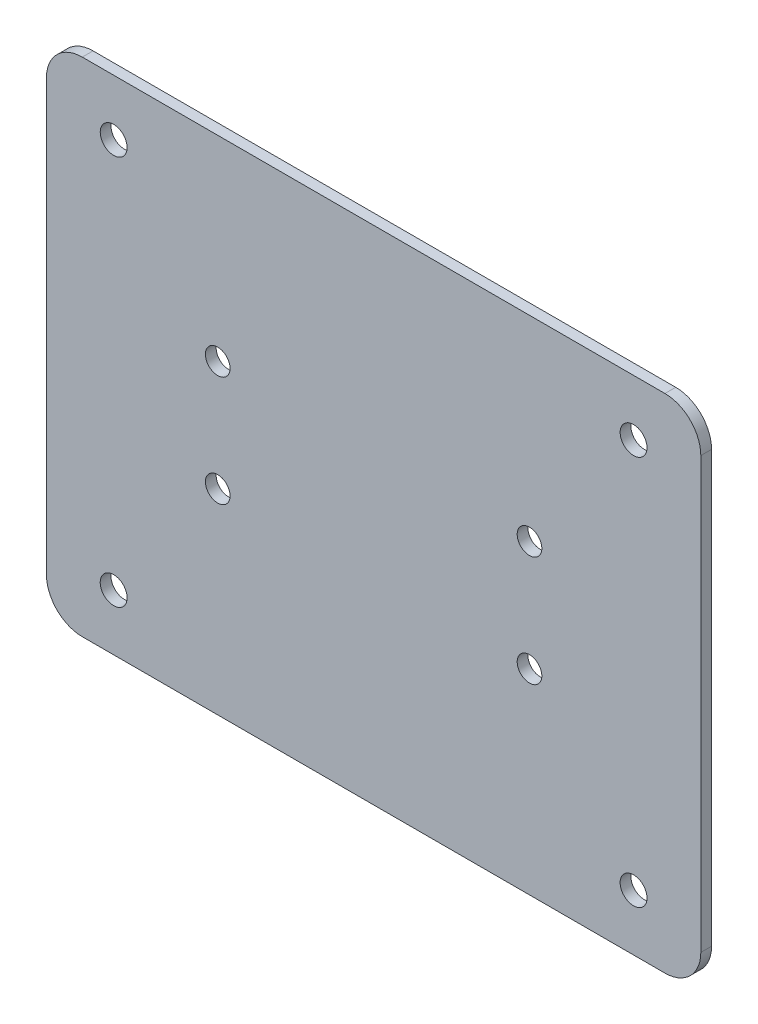
ISO-10303-21;
HEADER;
FILE_DESCRIPTION(('STEP AP214'),'2;1');
FILE_NAME('part.step','',(''),(''),'','','');
FILE_SCHEMA(('AUTOMOTIVE_DESIGN { 1 0 10303 214 1 1 1 1 }'));
ENDSEC;
DATA;
#1=APPLICATION_CONTEXT('core data for automotive mechanical design processes');
#2=APPLICATION_PROTOCOL_DEFINITION('international standard','automotive_design',2000,#1);
#3=PRODUCT_CONTEXT('',#1,'mechanical');
#4=PRODUCT('Part','Part','',(#3));
#5=PRODUCT_RELATED_PRODUCT_CATEGORY('part','',(#4));
#6=PRODUCT_DEFINITION_FORMATION('','',#4);
#7=PRODUCT_DEFINITION_CONTEXT('part definition',#1,'design');
#8=PRODUCT_DEFINITION('design','',#6,#7);
#9=PRODUCT_DEFINITION_SHAPE('','',#8);
#10=(LENGTH_UNIT() NAMED_UNIT(*) SI_UNIT(.MILLI.,.METRE.));
#11=(NAMED_UNIT(*) PLANE_ANGLE_UNIT() SI_UNIT($,.RADIAN.));
#12=(NAMED_UNIT(*) SI_UNIT($,.STERADIAN.) SOLID_ANGLE_UNIT());
#13=UNCERTAINTY_MEASURE_WITH_UNIT(LENGTH_MEASURE(1.E-05),#10,'distance_accuracy_value','');
#14=(GEOMETRIC_REPRESENTATION_CONTEXT(3) GLOBAL_UNCERTAINTY_ASSIGNED_CONTEXT((#13)) GLOBAL_UNIT_ASSIGNED_CONTEXT((#10,
#11,#12)) REPRESENTATION_CONTEXT('',''));
#15=CARTESIAN_POINT('',(0.,0.,0.));
#16=DIRECTION('',(0.,0.,1.));
#17=DIRECTION('',(1.,0.,0.));
#18=AXIS2_PLACEMENT_3D('',#15,#16,#17);
#19=CARTESIAN_POINT('',(0.,0.,1.2));
#20=DIRECTION('',(0.,0.,-1.));
#21=DIRECTION('',(-1.,0.,0.));
#22=AXIS2_PLACEMENT_3D('',#19,#20,#21);
#23=PLANE('',#22);
#24=CARTESIAN_POINT('',(53.89,34.16,1.2));
#25=DIRECTION('',(0.,0.,1.));
#26=DIRECTION('',(-1.,0.,0.));
#27=AXIS2_PLACEMENT_3D('',#24,#25,#26);
#28=CIRCLE('',#27,1.375);
#29=CARTESIAN_POINT('',(52.515,34.16,1.2));
#30=VERTEX_POINT('',#29);
#31=EDGE_CURVE('E204',#30,#30,#28,.T.);
#32=ORIENTED_EDGE('',*,*,#31,.F.);
#33=EDGE_LOOP('',(#32));
#34=FACE_BOUND('',#33,.T.);
#35=CARTESIAN_POINT('',(19.11,21.84,1.2));
#36=DIRECTION('',(0.,0.,1.));
#37=DIRECTION('',(-1.,0.,0.));
#38=AXIS2_PLACEMENT_3D('',#35,#36,#37);
#39=CIRCLE('',#38,1.375);
#40=CARTESIAN_POINT('',(17.735,21.84,1.2));
#41=VERTEX_POINT('',#40);
#42=EDGE_CURVE('E210',#41,#41,#39,.T.);
#43=ORIENTED_EDGE('',*,*,#42,.F.);
#44=EDGE_LOOP('',(#43));
#45=FACE_BOUND('',#44,.T.);
#46=CARTESIAN_POINT('',(19.11,34.16,1.2));
#47=DIRECTION('',(0.,0.,1.));
#48=DIRECTION('',(1.,0.,0.));
#49=AXIS2_PLACEMENT_3D('',#46,#47,#48);
#50=CIRCLE('',#49,1.375);
#51=CARTESIAN_POINT('',(20.485,34.16,1.2));
#52=VERTEX_POINT('',#51);
#53=EDGE_CURVE('E211',#52,#52,#50,.T.);
#54=ORIENTED_EDGE('',*,*,#53,.F.);
#55=EDGE_LOOP('',(#54));
#56=FACE_BOUND('',#55,.T.);
#57=CARTESIAN_POINT('',(53.89,21.84,1.2));
#58=DIRECTION('',(0.,0.,1.));
#59=DIRECTION('',(1.,0.,0.));
#60=AXIS2_PLACEMENT_3D('',#57,#58,#59);
#61=CIRCLE('',#60,1.375);
#62=CARTESIAN_POINT('',(55.265,21.84,1.2));
#63=VERTEX_POINT('',#62);
#64=EDGE_CURVE('E198',#63,#63,#61,.T.);
#65=ORIENTED_EDGE('',*,*,#64,.F.);
#66=EDGE_LOOP('',(#65));
#67=FACE_BOUND('',#66,.T.);
#68=DIRECTION('',(0.,-1.,0.));
#69=VECTOR('',#68,1.);
#70=CARTESIAN_POINT('',(0.,0.,1.2));
#71=LINE('',#70,#69);
#72=CARTESIAN_POINT('',(0.,52.,1.2));
#73=VERTEX_POINT('',#72);
#74=CARTESIAN_POINT('',(0.,4.,1.2));
#75=VERTEX_POINT('',#74);
#76=EDGE_CURVE('E137',#73,#75,#71,.T.);
#77=ORIENTED_EDGE('',*,*,#76,.T.);
#78=CARTESIAN_POINT('',(4.,4.,1.2));
#79=DIRECTION('',(0.,0.,-1.));
#80=DIRECTION('',(-1.,0.,0.));
#81=AXIS2_PLACEMENT_3D('',#78,#79,#80);
#82=CIRCLE('',#81,4.);
#83=CARTESIAN_POINT('',(4.,0.,1.2));
#84=VERTEX_POINT('',#83);
#85=EDGE_CURVE('E152',#75,#84,#82,.F.);
#86=ORIENTED_EDGE('',*,*,#85,.T.);
#87=DIRECTION('',(1.,0.,0.));
#88=VECTOR('',#87,1.);
#89=CARTESIAN_POINT('',(0.,0.,1.2));
#90=LINE('',#89,#88);
#91=CARTESIAN_POINT('',(69.,0.,1.2));
#92=VERTEX_POINT('',#91);
#93=EDGE_CURVE('E119',#84,#92,#90,.T.);
#94=ORIENTED_EDGE('',*,*,#93,.T.);
#95=CARTESIAN_POINT('',(69.,4.,1.2));
#96=DIRECTION('',(0.,0.,-1.));
#97=DIRECTION('',(-1.,0.,0.));
#98=AXIS2_PLACEMENT_3D('',#95,#96,#97);
#99=CIRCLE('',#98,4.);
#100=CARTESIAN_POINT('',(73.,4.,1.2));
#101=VERTEX_POINT('',#100);
#102=EDGE_CURVE('E147',#92,#101,#99,.F.);
#103=ORIENTED_EDGE('',*,*,#102,.T.);
#104=DIRECTION('',(0.,1.,0.));
#105=VECTOR('',#104,1.);
#106=CARTESIAN_POINT('',(73.,0.,1.2));
#107=LINE('',#106,#105);
#108=CARTESIAN_POINT('',(73.,52.,1.2));
#109=VERTEX_POINT('',#108);
#110=EDGE_CURVE('E163',#101,#109,#107,.T.);
#111=ORIENTED_EDGE('',*,*,#110,.T.);
#112=CARTESIAN_POINT('',(69.,52.,1.2));
#113=DIRECTION('',(0.,0.,-1.));
#114=DIRECTION('',(-1.,0.,0.));
#115=AXIS2_PLACEMENT_3D('',#112,#113,#114);
#116=CIRCLE('',#115,4.);
#117=CARTESIAN_POINT('',(69.,56.,1.2));
#118=VERTEX_POINT('',#117);
#119=EDGE_CURVE('E55',#109,#118,#116,.F.);
#120=ORIENTED_EDGE('',*,*,#119,.T.);
#121=DIRECTION('',(-1.,0.,0.));
#122=VECTOR('',#121,1.);
#123=CARTESIAN_POINT('',(0.,56.,1.2));
#124=LINE('',#123,#122);
#125=CARTESIAN_POINT('',(4.,56.,1.2));
#126=VERTEX_POINT('',#125);
#127=EDGE_CURVE('E138',#118,#126,#124,.T.);
#128=ORIENTED_EDGE('',*,*,#127,.T.);
#129=CARTESIAN_POINT('',(4.,52.,1.2));
#130=DIRECTION('',(0.,0.,-1.));
#131=DIRECTION('',(-1.,0.,0.));
#132=AXIS2_PLACEMENT_3D('',#129,#130,#131);
#133=CIRCLE('',#132,4.);
#134=EDGE_CURVE('E150',#126,#73,#133,.F.);
#135=ORIENTED_EDGE('',*,*,#134,.T.);
#136=EDGE_LOOP('',(#77,#86,#94,#103,#111,#120,#128,#135));
#137=FACE_BOUND('',#136,.T.);
#138=CARTESIAN_POINT('',(7.5,6.25,1.2));
#139=DIRECTION('',(0.,0.,1.));
#140=DIRECTION('',(1.,0.,0.));
#141=AXIS2_PLACEMENT_3D('',#138,#139,#140);
#142=CIRCLE('',#141,1.5);
#143=CARTESIAN_POINT('',(9.,6.25,1.2));
#144=VERTEX_POINT('',#143);
#145=EDGE_CURVE('E132',#144,#144,#142,.T.);
#146=ORIENTED_EDGE('',*,*,#145,.F.);
#147=EDGE_LOOP('',(#146));
#148=FACE_BOUND('',#147,.T.);
#149=CARTESIAN_POINT('',(65.5,6.25,1.2));
#150=DIRECTION('',(0.,0.,1.));
#151=DIRECTION('',(-1.,0.,0.));
#152=AXIS2_PLACEMENT_3D('',#149,#150,#151);
#153=CIRCLE('',#152,1.5);
#154=CARTESIAN_POINT('',(64.,6.25,1.2));
#155=VERTEX_POINT('',#154);
#156=EDGE_CURVE('E180',#155,#155,#153,.T.);
#157=ORIENTED_EDGE('',*,*,#156,.F.);
#158=EDGE_LOOP('',(#157));
#159=FACE_BOUND('',#158,.T.);
#160=CARTESIAN_POINT('',(65.5,49.75,1.2));
#161=DIRECTION('',(0.,0.,1.));
#162=DIRECTION('',(1.,0.,0.));
#163=AXIS2_PLACEMENT_3D('',#160,#161,#162);
#164=CIRCLE('',#163,1.5);
#165=CARTESIAN_POINT('',(67.,49.75,1.2));
#166=VERTEX_POINT('',#165);
#167=EDGE_CURVE('E186',#166,#166,#164,.T.);
#168=ORIENTED_EDGE('',*,*,#167,.F.);
#169=EDGE_LOOP('',(#168));
#170=FACE_BOUND('',#169,.T.);
#171=CARTESIAN_POINT('',(7.5,49.75,1.2));
#172=DIRECTION('',(0.,0.,1.));
#173=DIRECTION('',(-1.,0.,0.));
#174=AXIS2_PLACEMENT_3D('',#171,#172,#173);
#175=CIRCLE('',#174,1.5);
#176=CARTESIAN_POINT('',(5.99999999999999,49.75,1.2));
#177=VERTEX_POINT('',#176);
#178=EDGE_CURVE('E192',#177,#177,#175,.T.);
#179=ORIENTED_EDGE('',*,*,#178,.F.);
#180=EDGE_LOOP('',(#179));
#181=FACE_BOUND('',#180,.T.);
#182=ADVANCED_FACE('F33',(#34,#45,#56,#67,#137,#148,#159,#170,#181),#23,.F.);
#183=CARTESIAN_POINT('',(0.,0.,0.));
#184=DIRECTION('',(0.,0.,-1.));
#185=DIRECTION('',(-1.,0.,0.));
#186=AXIS2_PLACEMENT_3D('',#183,#184,#185);
#187=PLANE('',#186);
#188=CARTESIAN_POINT('',(53.89,34.16,0.));
#189=DIRECTION('',(0.,0.,-1.));
#190=DIRECTION('',(-1.,0.,0.));
#191=AXIS2_PLACEMENT_3D('',#188,#189,#190);
#192=CIRCLE('',#191,1.375);
#193=CARTESIAN_POINT('',(52.515,34.16,0.));
#194=VERTEX_POINT('',#193);
#195=EDGE_CURVE('E214',#194,#194,#192,.F.);
#196=ORIENTED_EDGE('',*,*,#195,.T.);
#197=EDGE_LOOP('',(#196));
#198=FACE_BOUND('',#197,.T.);
#199=CARTESIAN_POINT('',(19.11,21.84,0.));
#200=DIRECTION('',(0.,0.,-1.));
#201=DIRECTION('',(-1.,0.,0.));
#202=AXIS2_PLACEMENT_3D('',#199,#200,#201);
#203=CIRCLE('',#202,1.375);
#204=CARTESIAN_POINT('',(17.735,21.84,0.));
#205=VERTEX_POINT('',#204);
#206=EDGE_CURVE('E207',#205,#205,#203,.F.);
#207=ORIENTED_EDGE('',*,*,#206,.T.);
#208=EDGE_LOOP('',(#207));
#209=FACE_BOUND('',#208,.T.);
#210=CARTESIAN_POINT('',(19.11,34.16,0.));
#211=DIRECTION('',(0.,0.,-1.));
#212=DIRECTION('',(-1.,0.,0.));
#213=AXIS2_PLACEMENT_3D('',#210,#211,#212);
#214=CIRCLE('',#213,1.375);
#215=CARTESIAN_POINT('',(17.735,34.16,0.));
#216=VERTEX_POINT('',#215);
#217=EDGE_CURVE('E219',#216,#216,#214,.F.);
#218=ORIENTED_EDGE('',*,*,#217,.T.);
#219=EDGE_LOOP('',(#218));
#220=FACE_BOUND('',#219,.T.);
#221=CARTESIAN_POINT('',(53.89,21.84,0.));
#222=DIRECTION('',(0.,0.,-1.));
#223=DIRECTION('',(-1.,0.,0.));
#224=AXIS2_PLACEMENT_3D('',#221,#222,#223);
#225=CIRCLE('',#224,1.375);
#226=CARTESIAN_POINT('',(52.515,21.84,0.));
#227=VERTEX_POINT('',#226);
#228=EDGE_CURVE('E201',#227,#227,#225,.F.);
#229=ORIENTED_EDGE('',*,*,#228,.T.);
#230=EDGE_LOOP('',(#229));
#231=FACE_BOUND('',#230,.T.);
#232=CARTESIAN_POINT('',(65.5,49.75,0.));
#233=DIRECTION('',(0.,0.,1.));
#234=DIRECTION('',(1.,0.,0.));
#235=AXIS2_PLACEMENT_3D('',#232,#233,#234);
#236=CIRCLE('',#235,1.5);
#237=CARTESIAN_POINT('',(67.,49.75,0.));
#238=VERTEX_POINT('',#237);
#239=EDGE_CURVE('E189',#238,#238,#236,.T.);
#240=ORIENTED_EDGE('',*,*,#239,.T.);
#241=EDGE_LOOP('',(#240));
#242=FACE_BOUND('',#241,.T.);
#243=CARTESIAN_POINT('',(7.5,6.25,0.));
#244=DIRECTION('',(0.,0.,1.));
#245=DIRECTION('',(1.,0.,0.));
#246=AXIS2_PLACEMENT_3D('',#243,#244,#245);
#247=CIRCLE('',#246,1.5);
#248=CARTESIAN_POINT('',(9.,6.25,0.));
#249=VERTEX_POINT('',#248);
#250=EDGE_CURVE('E177',#249,#249,#247,.T.);
#251=ORIENTED_EDGE('',*,*,#250,.T.);
#252=EDGE_LOOP('',(#251));
#253=FACE_BOUND('',#252,.T.);
#254=DIRECTION('',(1.,0.,0.));
#255=VECTOR('',#254,1.);
#256=CARTESIAN_POINT('',(0.,0.,0.));
#257=LINE('',#256,#255);
#258=CARTESIAN_POINT('',(4.,0.,0.));
#259=VERTEX_POINT('',#258);
#260=CARTESIAN_POINT('',(69.,0.,0.));
#261=VERTEX_POINT('',#260);
#262=EDGE_CURVE('E116',#259,#261,#257,.T.);
#263=ORIENTED_EDGE('',*,*,#262,.F.);
#264=CARTESIAN_POINT('',(4.,4.,0.));
#265=DIRECTION('',(0.,0.,-1.));
#266=DIRECTION('',(-1.,0.,0.));
#267=AXIS2_PLACEMENT_3D('',#264,#265,#266);
#268=CIRCLE('',#267,4.);
#269=CARTESIAN_POINT('',(0.,4.,0.));
#270=VERTEX_POINT('',#269);
#271=EDGE_CURVE('E99',#259,#270,#268,.T.);
#272=ORIENTED_EDGE('',*,*,#271,.T.);
#273=DIRECTION('',(0.,-1.,0.));
#274=VECTOR('',#273,1.);
#275=CARTESIAN_POINT('',(0.,0.,0.));
#276=LINE('',#275,#274);
#277=CARTESIAN_POINT('',(0.,52.,0.));
#278=VERTEX_POINT('',#277);
#279=EDGE_CURVE('E127',#278,#270,#276,.T.);
#280=ORIENTED_EDGE('',*,*,#279,.F.);
#281=CARTESIAN_POINT('',(4.,52.,0.));
#282=DIRECTION('',(0.,0.,-1.));
#283=DIRECTION('',(-1.,0.,0.));
#284=AXIS2_PLACEMENT_3D('',#281,#282,#283);
#285=CIRCLE('',#284,4.);
#286=CARTESIAN_POINT('',(4.,56.,0.));
#287=VERTEX_POINT('',#286);
#288=EDGE_CURVE('E110',#278,#287,#285,.T.);
#289=ORIENTED_EDGE('',*,*,#288,.T.);
#290=DIRECTION('',(-1.,0.,0.));
#291=VECTOR('',#290,1.);
#292=CARTESIAN_POINT('',(0.,56.,0.));
#293=LINE('',#292,#291);
#294=CARTESIAN_POINT('',(69.,56.,0.));
#295=VERTEX_POINT('',#294);
#296=EDGE_CURVE('E130',#295,#287,#293,.T.);
#297=ORIENTED_EDGE('',*,*,#296,.F.);
#298=CARTESIAN_POINT('',(69.,52.,0.));
#299=DIRECTION('',(0.,0.,-1.));
#300=DIRECTION('',(-1.,0.,0.));
#301=AXIS2_PLACEMENT_3D('',#298,#299,#300);
#302=CIRCLE('',#301,4.);
#303=CARTESIAN_POINT('',(73.,52.,0.));
#304=VERTEX_POINT('',#303);
#305=EDGE_CURVE('E141',#295,#304,#302,.T.);
#306=ORIENTED_EDGE('',*,*,#305,.T.);
#307=DIRECTION('',(0.,1.,0.));
#308=VECTOR('',#307,1.);
#309=CARTESIAN_POINT('',(73.,0.,0.));
#310=LINE('',#309,#308);
#311=CARTESIAN_POINT('',(73.,4.,0.));
#312=VERTEX_POINT('',#311);
#313=EDGE_CURVE('E126',#312,#304,#310,.T.);
#314=ORIENTED_EDGE('',*,*,#313,.F.);
#315=CARTESIAN_POINT('',(69.,4.,0.));
#316=DIRECTION('',(0.,0.,-1.));
#317=DIRECTION('',(-1.,0.,0.));
#318=AXIS2_PLACEMENT_3D('',#315,#316,#317);
#319=CIRCLE('',#318,4.);
#320=EDGE_CURVE('E120',#312,#261,#319,.T.);
#321=ORIENTED_EDGE('',*,*,#320,.T.);
#322=EDGE_LOOP('',(#263,#272,#280,#289,#297,#306,#314,#321));
#323=FACE_BOUND('',#322,.T.);
#324=CARTESIAN_POINT('',(65.5,6.25,0.));
#325=DIRECTION('',(0.,0.,1.));
#326=DIRECTION('',(-1.,0.,0.));
#327=AXIS2_PLACEMENT_3D('',#324,#325,#326);
#328=CIRCLE('',#327,1.5);
#329=CARTESIAN_POINT('',(64.,6.25,0.));
#330=VERTEX_POINT('',#329);
#331=EDGE_CURVE('E183',#330,#330,#328,.T.);
#332=ORIENTED_EDGE('',*,*,#331,.T.);
#333=EDGE_LOOP('',(#332));
#334=FACE_BOUND('',#333,.T.);
#335=CARTESIAN_POINT('',(7.5,49.75,0.));
#336=DIRECTION('',(0.,0.,1.));
#337=DIRECTION('',(-1.,0.,0.));
#338=AXIS2_PLACEMENT_3D('',#335,#336,#337);
#339=CIRCLE('',#338,1.5);
#340=CARTESIAN_POINT('',(5.99999999999999,49.75,0.));
#341=VERTEX_POINT('',#340);
#342=EDGE_CURVE('E195',#341,#341,#339,.T.);
#343=ORIENTED_EDGE('',*,*,#342,.T.);
#344=EDGE_LOOP('',(#343));
#345=FACE_BOUND('',#344,.T.);
#346=ADVANCED_FACE('F123',(#198,#209,#220,#231,#242,#253,#323,#334,#345),#187,.T.);
#347=CARTESIAN_POINT('',(0.,0.,1.2));
#348=DIRECTION('',(1.,0.,0.));
#349=DIRECTION('',(0.,0.,-1.));
#350=AXIS2_PLACEMENT_3D('',#347,#348,#349);
#351=PLANE('',#350);
#352=ORIENTED_EDGE('',*,*,#279,.T.);
#353=DIRECTION('',(0.,0.,-1.));
#354=VECTOR('',#353,1.);
#355=CARTESIAN_POINT('',(0.,4.,1.2));
#356=LINE('',#355,#354);
#357=EDGE_CURVE('E104',#270,#75,#356,.F.);
#358=ORIENTED_EDGE('',*,*,#357,.T.);
#359=ORIENTED_EDGE('',*,*,#76,.F.);
#360=DIRECTION('',(0.,0.,-1.));
#361=VECTOR('',#360,1.);
#362=CARTESIAN_POINT('',(0.,52.,1.2));
#363=LINE('',#362,#361);
#364=EDGE_CURVE('E109',#73,#278,#363,.T.);
#365=ORIENTED_EDGE('',*,*,#364,.T.);
#366=EDGE_LOOP('',(#352,#358,#359,#365));
#367=FACE_BOUND('',#366,.T.);
#368=ADVANCED_FACE('F250',(#367),#351,.F.);
#369=CARTESIAN_POINT('',(0.,0.,1.2));
#370=DIRECTION('',(0.,1.,0.));
#371=DIRECTION('',(0.,0.,1.));
#372=AXIS2_PLACEMENT_3D('',#369,#370,#371);
#373=PLANE('',#372);
#374=ORIENTED_EDGE('',*,*,#93,.F.);
#375=DIRECTION('',(0.,0.,-1.));
#376=VECTOR('',#375,1.);
#377=CARTESIAN_POINT('',(4.,0.,1.2));
#378=LINE('',#377,#376);
#379=EDGE_CURVE('E103',#84,#259,#378,.T.);
#380=ORIENTED_EDGE('',*,*,#379,.T.);
#381=ORIENTED_EDGE('',*,*,#262,.T.);
#382=DIRECTION('',(0.,0.,-1.));
#383=VECTOR('',#382,1.);
#384=CARTESIAN_POINT('',(69.,0.,1.2));
#385=LINE('',#384,#383);
#386=EDGE_CURVE('E121',#261,#92,#385,.F.);
#387=ORIENTED_EDGE('',*,*,#386,.T.);
#388=EDGE_LOOP('',(#374,#380,#381,#387));
#389=FACE_BOUND('',#388,.T.);
#390=ADVANCED_FACE('F115',(#389),#373,.F.);
#391=CARTESIAN_POINT('',(73.,0.,1.2));
#392=DIRECTION('',(-1.,0.,0.));
#393=DIRECTION('',(0.,0.,1.));
#394=AXIS2_PLACEMENT_3D('',#391,#392,#393);
#395=PLANE('',#394);
#396=ORIENTED_EDGE('',*,*,#313,.T.);
#397=DIRECTION('',(0.,0.,-1.));
#398=VECTOR('',#397,1.);
#399=CARTESIAN_POINT('',(73.,52.,1.2));
#400=LINE('',#399,#398);
#401=EDGE_CURVE('E11',#304,#109,#400,.F.);
#402=ORIENTED_EDGE('',*,*,#401,.T.);
#403=ORIENTED_EDGE('',*,*,#110,.F.);
#404=DIRECTION('',(0.,0.,-1.));
#405=VECTOR('',#404,1.);
#406=CARTESIAN_POINT('',(73.,4.,1.2));
#407=LINE('',#406,#405);
#408=EDGE_CURVE('E41',#101,#312,#407,.T.);
#409=ORIENTED_EDGE('',*,*,#408,.T.);
#410=EDGE_LOOP('',(#396,#402,#403,#409));
#411=FACE_BOUND('',#410,.T.);
#412=ADVANCED_FACE('F161',(#411),#395,.F.);
#413=CARTESIAN_POINT('',(0.,56.,1.2));
#414=DIRECTION('',(0.,-1.,0.));
#415=DIRECTION('',(0.,0.,-1.));
#416=AXIS2_PLACEMENT_3D('',#413,#414,#415);
#417=PLANE('',#416);
#418=ORIENTED_EDGE('',*,*,#296,.T.);
#419=DIRECTION('',(0.,0.,-1.));
#420=VECTOR('',#419,1.);
#421=CARTESIAN_POINT('',(4.,56.,1.2));
#422=LINE('',#421,#420);
#423=EDGE_CURVE('E48',#287,#126,#422,.F.);
#424=ORIENTED_EDGE('',*,*,#423,.T.);
#425=ORIENTED_EDGE('',*,*,#127,.F.);
#426=DIRECTION('',(0.,0.,-1.));
#427=VECTOR('',#426,1.);
#428=CARTESIAN_POINT('',(69.,56.,1.2));
#429=LINE('',#428,#427);
#430=EDGE_CURVE('E154',#118,#295,#429,.T.);
#431=ORIENTED_EDGE('',*,*,#430,.T.);
#432=EDGE_LOOP('',(#418,#424,#425,#431));
#433=FACE_BOUND('',#432,.T.);
#434=ADVANCED_FACE('F170',(#433),#417,.F.);
#435=CARTESIAN_POINT('',(7.5,6.25,1.2));
#436=DIRECTION('',(0.,0.,-1.));
#437=DIRECTION('',(-1.,0.,0.));
#438=AXIS2_PLACEMENT_3D('',#435,#436,#437);
#439=CYLINDRICAL_SURFACE('',#438,1.5);
#440=ORIENTED_EDGE('',*,*,#145,.T.);
#441=EDGE_LOOP('',(#440));
#442=FACE_BOUND('',#441,.T.);
#443=ORIENTED_EDGE('',*,*,#250,.F.);
#444=EDGE_LOOP('',(#443));
#445=FACE_BOUND('',#444,.T.);
#446=ADVANCED_FACE('F263',(#442,#445),#439,.F.);
#447=CARTESIAN_POINT('',(65.5,6.25,1.2));
#448=DIRECTION('',(0.,0.,-1.));
#449=DIRECTION('',(-1.,0.,0.));
#450=AXIS2_PLACEMENT_3D('',#447,#448,#449);
#451=CYLINDRICAL_SURFACE('',#450,1.5);
#452=ORIENTED_EDGE('',*,*,#156,.T.);
#453=EDGE_LOOP('',(#452));
#454=FACE_BOUND('',#453,.T.);
#455=ORIENTED_EDGE('',*,*,#331,.F.);
#456=EDGE_LOOP('',(#455));
#457=FACE_BOUND('',#456,.T.);
#458=ADVANCED_FACE('F296',(#454,#457),#451,.F.);
#459=CARTESIAN_POINT('',(65.5,49.75,1.2));
#460=DIRECTION('',(0.,0.,-1.));
#461=DIRECTION('',(-1.,0.,0.));
#462=AXIS2_PLACEMENT_3D('',#459,#460,#461);
#463=CYLINDRICAL_SURFACE('',#462,1.5);
#464=ORIENTED_EDGE('',*,*,#167,.T.);
#465=EDGE_LOOP('',(#464));
#466=FACE_BOUND('',#465,.T.);
#467=ORIENTED_EDGE('',*,*,#239,.F.);
#468=EDGE_LOOP('',(#467));
#469=FACE_BOUND('',#468,.T.);
#470=ADVANCED_FACE('F245',(#466,#469),#463,.F.);
#471=CARTESIAN_POINT('',(7.5,49.75,1.2));
#472=DIRECTION('',(0.,0.,-1.));
#473=DIRECTION('',(-1.,0.,0.));
#474=AXIS2_PLACEMENT_3D('',#471,#472,#473);
#475=CYLINDRICAL_SURFACE('',#474,1.5);
#476=ORIENTED_EDGE('',*,*,#178,.T.);
#477=EDGE_LOOP('',(#476));
#478=FACE_BOUND('',#477,.T.);
#479=ORIENTED_EDGE('',*,*,#342,.F.);
#480=EDGE_LOOP('',(#479));
#481=FACE_BOUND('',#480,.T.);
#482=ADVANCED_FACE('F242',(#478,#481),#475,.F.);
#483=CARTESIAN_POINT('',(4.,4.,1.2));
#484=DIRECTION('',(0.,0.,-1.));
#485=DIRECTION('',(-1.,0.,0.));
#486=AXIS2_PLACEMENT_3D('',#483,#484,#485);
#487=CYLINDRICAL_SURFACE('',#486,4.);
#488=ORIENTED_EDGE('',*,*,#85,.F.);
#489=ORIENTED_EDGE('',*,*,#357,.F.);
#490=ORIENTED_EDGE('',*,*,#271,.F.);
#491=ORIENTED_EDGE('',*,*,#379,.F.);
#492=EDGE_LOOP('',(#488,#489,#490,#491));
#493=FACE_BOUND('',#492,.T.);
#494=ADVANCED_FACE('F102',(#493),#487,.T.);
#495=CARTESIAN_POINT('',(4.,52.,1.2));
#496=DIRECTION('',(0.,0.,-1.));
#497=DIRECTION('',(-1.,0.,0.));
#498=AXIS2_PLACEMENT_3D('',#495,#496,#497);
#499=CYLINDRICAL_SURFACE('',#498,4.);
#500=ORIENTED_EDGE('',*,*,#134,.F.);
#501=ORIENTED_EDGE('',*,*,#423,.F.);
#502=ORIENTED_EDGE('',*,*,#288,.F.);
#503=ORIENTED_EDGE('',*,*,#364,.F.);
#504=EDGE_LOOP('',(#500,#501,#502,#503));
#505=FACE_BOUND('',#504,.T.);
#506=ADVANCED_FACE('F270',(#505),#499,.T.);
#507=CARTESIAN_POINT('',(69.,52.,1.2));
#508=DIRECTION('',(0.,0.,-1.));
#509=DIRECTION('',(-1.,0.,0.));
#510=AXIS2_PLACEMENT_3D('',#507,#508,#509);
#511=CYLINDRICAL_SURFACE('',#510,4.);
#512=ORIENTED_EDGE('',*,*,#119,.F.);
#513=ORIENTED_EDGE('',*,*,#401,.F.);
#514=ORIENTED_EDGE('',*,*,#305,.F.);
#515=ORIENTED_EDGE('',*,*,#430,.F.);
#516=EDGE_LOOP('',(#512,#513,#514,#515));
#517=FACE_BOUND('',#516,.T.);
#518=ADVANCED_FACE('F169',(#517),#511,.T.);
#519=CARTESIAN_POINT('',(69.,4.,1.2));
#520=DIRECTION('',(0.,0.,-1.));
#521=DIRECTION('',(-1.,0.,0.));
#522=AXIS2_PLACEMENT_3D('',#519,#520,#521);
#523=CYLINDRICAL_SURFACE('',#522,4.);
#524=ORIENTED_EDGE('',*,*,#102,.F.);
#525=ORIENTED_EDGE('',*,*,#386,.F.);
#526=ORIENTED_EDGE('',*,*,#320,.F.);
#527=ORIENTED_EDGE('',*,*,#408,.F.);
#528=EDGE_LOOP('',(#524,#525,#526,#527));
#529=FACE_BOUND('',#528,.T.);
#530=ADVANCED_FACE('F35',(#529),#523,.T.);
#531=CARTESIAN_POINT('',(53.89,21.84,-0.000999999999999916));
#532=DIRECTION('',(0.,0.,1.));
#533=DIRECTION('',(1.,0.,0.));
#534=AXIS2_PLACEMENT_3D('',#531,#532,#533);
#535=CYLINDRICAL_SURFACE('',#534,1.375);
#536=ORIENTED_EDGE('',*,*,#228,.F.);
#537=EDGE_LOOP('',(#536));
#538=FACE_BOUND('',#537,.T.);
#539=ORIENTED_EDGE('',*,*,#64,.T.);
#540=EDGE_LOOP('',(#539));
#541=FACE_BOUND('',#540,.T.);
#542=ADVANCED_FACE('F277',(#538,#541),#535,.F.);
#543=CARTESIAN_POINT('',(19.11,34.16,-0.000999999999999916));
#544=DIRECTION('',(0.,0.,1.));
#545=DIRECTION('',(1.,0.,0.));
#546=AXIS2_PLACEMENT_3D('',#543,#544,#545);
#547=CYLINDRICAL_SURFACE('',#546,1.375);
#548=ORIENTED_EDGE('',*,*,#217,.F.);
#549=EDGE_LOOP('',(#548));
#550=FACE_BOUND('',#549,.T.);
#551=ORIENTED_EDGE('',*,*,#53,.T.);
#552=EDGE_LOOP('',(#551));
#553=FACE_BOUND('',#552,.T.);
#554=ADVANCED_FACE('F225',(#550,#553),#547,.F.);
#555=CARTESIAN_POINT('',(19.11,21.84,-0.000999999999999916));
#556=DIRECTION('',(0.,0.,1.));
#557=DIRECTION('',(1.,0.,0.));
#558=AXIS2_PLACEMENT_3D('',#555,#556,#557);
#559=CYLINDRICAL_SURFACE('',#558,1.375);
#560=ORIENTED_EDGE('',*,*,#206,.F.);
#561=EDGE_LOOP('',(#560));
#562=FACE_BOUND('',#561,.T.);
#563=ORIENTED_EDGE('',*,*,#42,.T.);
#564=EDGE_LOOP('',(#563));
#565=FACE_BOUND('',#564,.T.);
#566=ADVANCED_FACE('F286',(#562,#565),#559,.F.);
#567=CARTESIAN_POINT('',(53.89,34.16,-0.000999999999999916));
#568=DIRECTION('',(0.,0.,1.));
#569=DIRECTION('',(1.,0.,0.));
#570=AXIS2_PLACEMENT_3D('',#567,#568,#569);
#571=CYLINDRICAL_SURFACE('',#570,1.375);
#572=ORIENTED_EDGE('',*,*,#195,.F.);
#573=EDGE_LOOP('',(#572));
#574=FACE_BOUND('',#573,.T.);
#575=ORIENTED_EDGE('',*,*,#31,.T.);
#576=EDGE_LOOP('',(#575));
#577=FACE_BOUND('',#576,.T.);
#578=ADVANCED_FACE('F368',(#574,#577),#571,.F.);
#579=CLOSED_SHELL('',(#182,#346,#368,#390,#412,#434,#446,#458,#470,#482,#494,#506,#518,#530,
#542,#554,#566,#578));
#580=MANIFOLD_SOLID_BREP('B2',#579);
#581=ADVANCED_BREP_SHAPE_REPRESENTATION('',(#18,#580),#14);
#582=SHAPE_DEFINITION_REPRESENTATION(#9,#581);
ENDSEC;
END-ISO-10303-21;
